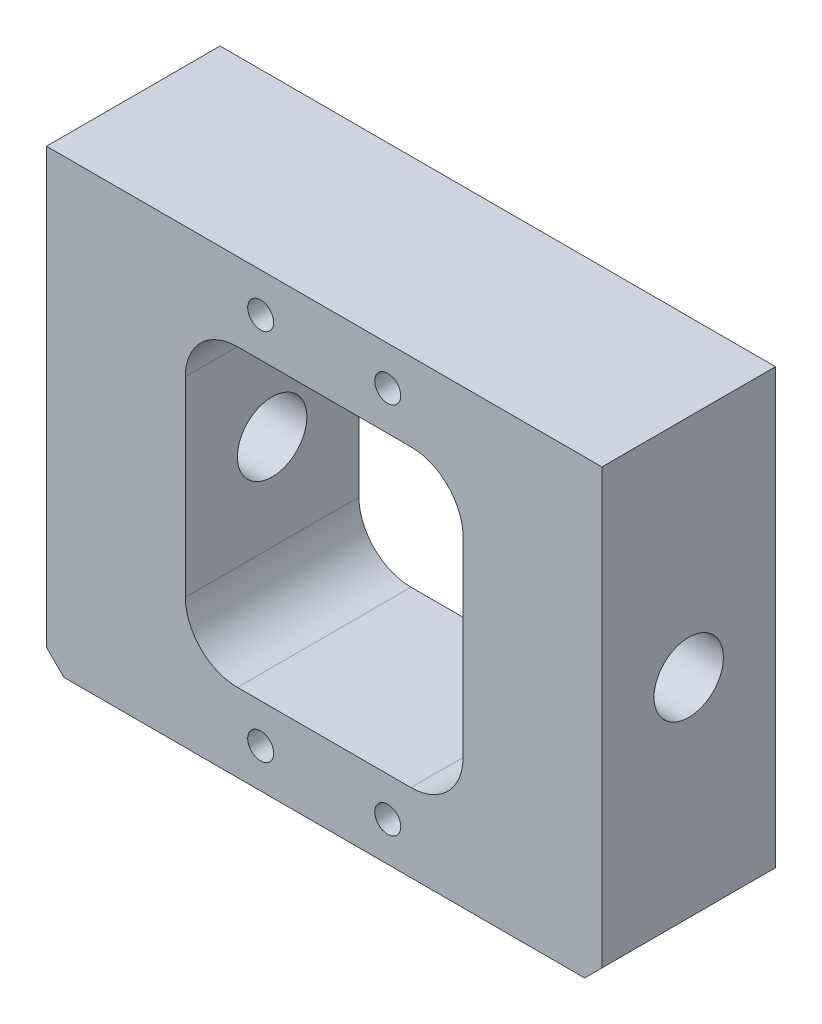
ISO-10303-21;
HEADER;
FILE_DESCRIPTION(('STEP AP214'),'2;1');
FILE_NAME('part.step','',(''),(''),'','','');
FILE_SCHEMA(('AUTOMOTIVE_DESIGN { 1 0 10303 214 1 1 1 1 }'));
ENDSEC;
DATA;
#1=APPLICATION_CONTEXT('core data for automotive mechanical design processes');
#2=APPLICATION_PROTOCOL_DEFINITION('international standard','automotive_design',2000,#1);
#3=PRODUCT_CONTEXT('',#1,'mechanical');
#4=PRODUCT('Part','Part','',(#3));
#5=PRODUCT_RELATED_PRODUCT_CATEGORY('part','',(#4));
#6=PRODUCT_DEFINITION_FORMATION('','',#4);
#7=PRODUCT_DEFINITION_CONTEXT('part definition',#1,'design');
#8=PRODUCT_DEFINITION('design','',#6,#7);
#9=PRODUCT_DEFINITION_SHAPE('','',#8);
#10=(LENGTH_UNIT() NAMED_UNIT(*) SI_UNIT(.MILLI.,.METRE.));
#11=(NAMED_UNIT(*) PLANE_ANGLE_UNIT() SI_UNIT($,.RADIAN.));
#12=(NAMED_UNIT(*) SI_UNIT($,.STERADIAN.) SOLID_ANGLE_UNIT());
#13=UNCERTAINTY_MEASURE_WITH_UNIT(LENGTH_MEASURE(1.E-05),#10,'distance_accuracy_value','');
#14=(GEOMETRIC_REPRESENTATION_CONTEXT(3) GLOBAL_UNCERTAINTY_ASSIGNED_CONTEXT((#13)) GLOBAL_UNIT_ASSIGNED_CONTEXT((#10,
#11,#12)) REPRESENTATION_CONTEXT('',''));
#15=CARTESIAN_POINT('',(0.,0.,0.));
#16=DIRECTION('',(0.,0.,1.));
#17=DIRECTION('',(1.,0.,0.));
#18=AXIS2_PLACEMENT_3D('',#15,#16,#17);
#19=CARTESIAN_POINT('',(16.,13.,10.));
#20=DIRECTION('',(-1.,0.,0.));
#21=DIRECTION('',(0.,-1.,0.));
#22=AXIS2_PLACEMENT_3D('',#19,#20,#21);
#23=PLANE('',#22);
#24=CARTESIAN_POINT('',(16.,0.,5.));
#25=DIRECTION('',(-1.,0.,0.));
#26=DIRECTION('',(0.,0.,1.));
#27=AXIS2_PLACEMENT_3D('',#24,#25,#26);
#28=CIRCLE('',#27,2.);
#29=CARTESIAN_POINT('',(16.,0.,7.));
#30=VERTEX_POINT('',#29);
#31=EDGE_CURVE('E202',#30,#30,#28,.T.);
#32=ORIENTED_EDGE('',*,*,#31,.T.);
#33=EDGE_LOOP('',(#32));
#34=FACE_BOUND('',#33,.T.);
#35=DIRECTION('',(0.,1.,0.));
#36=VECTOR('',#35,1.);
#37=CARTESIAN_POINT('',(16.,13.,10.));
#38=LINE('',#37,#36);
#39=CARTESIAN_POINT('',(16.,-12.,10.));
#40=VERTEX_POINT('',#39);
#41=CARTESIAN_POINT('',(16.,13.,10.));
#42=VERTEX_POINT('',#41);
#43=EDGE_CURVE('E133',#40,#42,#38,.T.);
#44=ORIENTED_EDGE('',*,*,#43,.F.);
#45=DIRECTION('',(0.,0.,-1.));
#46=VECTOR('',#45,1.);
#47=CARTESIAN_POINT('',(16.,-12.,10.));
#48=LINE('',#47,#46);
#49=CARTESIAN_POINT('',(16.,-12.,0.));
#50=VERTEX_POINT('',#49);
#51=EDGE_CURVE('E197',#40,#50,#48,.T.);
#52=ORIENTED_EDGE('',*,*,#51,.T.);
#53=DIRECTION('',(0.,1.,0.));
#54=VECTOR('',#53,1.);
#55=CARTESIAN_POINT('',(16.,13.,0.));
#56=LINE('',#55,#54);
#57=CARTESIAN_POINT('',(16.,13.,0.));
#58=VERTEX_POINT('',#57);
#59=EDGE_CURVE('E154',#50,#58,#56,.T.);
#60=ORIENTED_EDGE('',*,*,#59,.T.);
#61=DIRECTION('',(0.,0.,-1.));
#62=VECTOR('',#61,1.);
#63=CARTESIAN_POINT('',(16.,13.,10.));
#64=LINE('',#63,#62);
#65=EDGE_CURVE('E148',#42,#58,#64,.T.);
#66=ORIENTED_EDGE('',*,*,#65,.F.);
#67=EDGE_LOOP('',(#44,#52,#60,#66));
#68=FACE_BOUND('',#67,.T.);
#69=ADVANCED_FACE('F31',(#34,#68),#23,.F.);
#70=CARTESIAN_POINT('',(-16.,13.,10.));
#71=DIRECTION('',(0.,-1.,0.));
#72=DIRECTION('',(0.,0.,-1.));
#73=AXIS2_PLACEMENT_3D('',#70,#71,#72);
#74=PLANE('',#73);
#75=DIRECTION('',(-1.,0.,0.));
#76=VECTOR('',#75,1.);
#77=CARTESIAN_POINT('',(-16.,13.,0.));
#78=LINE('',#77,#76);
#79=CARTESIAN_POINT('',(-16.,13.,0.));
#80=VERTEX_POINT('',#79);
#81=EDGE_CURVE('E224',#58,#80,#78,.T.);
#82=ORIENTED_EDGE('',*,*,#81,.T.);
#83=DIRECTION('',(0.,0.,-1.));
#84=VECTOR('',#83,1.);
#85=CARTESIAN_POINT('',(-16.,13.,10.));
#86=LINE('',#85,#84);
#87=CARTESIAN_POINT('',(-16.,13.,10.));
#88=VERTEX_POINT('',#87);
#89=EDGE_CURVE('E150',#88,#80,#86,.T.);
#90=ORIENTED_EDGE('',*,*,#89,.F.);
#91=DIRECTION('',(-1.,0.,0.));
#92=VECTOR('',#91,1.);
#93=CARTESIAN_POINT('',(-16.,13.,10.));
#94=LINE('',#93,#92);
#95=EDGE_CURVE('E136',#42,#88,#94,.T.);
#96=ORIENTED_EDGE('',*,*,#95,.F.);
#97=ORIENTED_EDGE('',*,*,#65,.T.);
#98=EDGE_LOOP('',(#82,#90,#96,#97));
#99=FACE_BOUND('',#98,.T.);
#100=ADVANCED_FACE('F147',(#99),#74,.F.);
#101=CARTESIAN_POINT('',(-16.,13.,10.));
#102=DIRECTION('',(1.,0.,0.));
#103=DIRECTION('',(0.,1.,0.));
#104=AXIS2_PLACEMENT_3D('',#101,#102,#103);
#105=PLANE('',#104);
#106=CARTESIAN_POINT('',(-16.,0.,5.));
#107=DIRECTION('',(-1.,0.,0.));
#108=DIRECTION('',(0.,0.,1.));
#109=AXIS2_PLACEMENT_3D('',#106,#107,#108);
#110=CIRCLE('',#109,2.);
#111=CARTESIAN_POINT('',(-16.,0.,7.));
#112=VERTEX_POINT('',#111);
#113=EDGE_CURVE('E256',#112,#112,#110,.T.);
#114=ORIENTED_EDGE('',*,*,#113,.F.);
#115=EDGE_LOOP('',(#114));
#116=FACE_BOUND('',#115,.T.);
#117=DIRECTION('',(0.,-1.,0.));
#118=VECTOR('',#117,1.);
#119=CARTESIAN_POINT('',(-16.,13.,0.));
#120=LINE('',#119,#118);
#121=CARTESIAN_POINT('',(-16.,-12.,0.));
#122=VERTEX_POINT('',#121);
#123=EDGE_CURVE('E222',#80,#122,#120,.T.);
#124=ORIENTED_EDGE('',*,*,#123,.T.);
#125=DIRECTION('',(0.,0.,1.));
#126=VECTOR('',#125,1.);
#127=CARTESIAN_POINT('',(-16.,-12.,10.));
#128=LINE('',#127,#126);
#129=CARTESIAN_POINT('',(-16.,-12.,10.));
#130=VERTEX_POINT('',#129);
#131=EDGE_CURVE('E11',#122,#130,#128,.T.);
#132=ORIENTED_EDGE('',*,*,#131,.T.);
#133=DIRECTION('',(0.,-1.,0.));
#134=VECTOR('',#133,1.);
#135=CARTESIAN_POINT('',(-16.,13.,10.));
#136=LINE('',#135,#134);
#137=EDGE_CURVE('E151',#88,#130,#136,.T.);
#138=ORIENTED_EDGE('',*,*,#137,.F.);
#139=ORIENTED_EDGE('',*,*,#89,.T.);
#140=EDGE_LOOP('',(#124,#132,#138,#139));
#141=FACE_BOUND('',#140,.T.);
#142=ADVANCED_FACE('F223',(#116,#141),#105,.F.);
#143=CARTESIAN_POINT('',(-16.,-13.,10.));
#144=DIRECTION('',(0.,1.,0.));
#145=DIRECTION('',(0.,0.,1.));
#146=AXIS2_PLACEMENT_3D('',#143,#144,#145);
#147=PLANE('',#146);
#148=DIRECTION('',(1.,0.,0.));
#149=VECTOR('',#148,1.);
#150=CARTESIAN_POINT('',(-16.,-13.,0.));
#151=LINE('',#150,#149);
#152=CARTESIAN_POINT('',(-15.,-13.,0.));
#153=VERTEX_POINT('',#152);
#154=CARTESIAN_POINT('',(15.,-13.,0.));
#155=VERTEX_POINT('',#154);
#156=EDGE_CURVE('E143',#153,#155,#151,.T.);
#157=ORIENTED_EDGE('',*,*,#156,.T.);
#158=DIRECTION('',(0.,0.,1.));
#159=VECTOR('',#158,1.);
#160=CARTESIAN_POINT('',(15.,-13.,10.));
#161=LINE('',#160,#159);
#162=CARTESIAN_POINT('',(15.,-13.,10.));
#163=VERTEX_POINT('',#162);
#164=EDGE_CURVE('E52',#155,#163,#161,.T.);
#165=ORIENTED_EDGE('',*,*,#164,.T.);
#166=DIRECTION('',(1.,0.,0.));
#167=VECTOR('',#166,1.);
#168=CARTESIAN_POINT('',(-16.,-13.,10.));
#169=LINE('',#168,#167);
#170=CARTESIAN_POINT('',(-15.,-13.,10.));
#171=VERTEX_POINT('',#170);
#172=EDGE_CURVE('E160',#171,#163,#169,.T.);
#173=ORIENTED_EDGE('',*,*,#172,.F.);
#174=DIRECTION('',(0.,0.,-1.));
#175=VECTOR('',#174,1.);
#176=CARTESIAN_POINT('',(-15.,-13.,10.));
#177=LINE('',#176,#175);
#178=EDGE_CURVE('E208',#171,#153,#177,.T.);
#179=ORIENTED_EDGE('',*,*,#178,.T.);
#180=EDGE_LOOP('',(#157,#165,#173,#179));
#181=FACE_BOUND('',#180,.T.);
#182=ADVANCED_FACE('F216',(#181),#147,.F.);
#183=CARTESIAN_POINT('',(16.,-13.,10.));
#184=DIRECTION('',(0.,0.,1.));
#185=DIRECTION('',(1.,0.,0.));
#186=AXIS2_PLACEMENT_3D('',#183,#184,#185);
#187=PLANE('',#186);
#188=CARTESIAN_POINT('',(3.65999999999999,-10.75,10.));
#189=DIRECTION('',(0.,0.,-1.));
#190=DIRECTION('',(1.,0.,0.));
#191=AXIS2_PLACEMENT_3D('',#188,#189,#190);
#192=CIRCLE('',#191,0.75);
#193=CARTESIAN_POINT('',(4.40999999999999,-10.75,10.));
#194=VERTEX_POINT('',#193);
#195=EDGE_CURVE('E277',#194,#194,#192,.T.);
#196=ORIENTED_EDGE('',*,*,#195,.T.);
#197=EDGE_LOOP('',(#196));
#198=FACE_BOUND('',#197,.T.);
#199=CARTESIAN_POINT('',(-3.66000000000001,-10.75,10.));
#200=DIRECTION('',(0.,0.,-1.));
#201=DIRECTION('',(-1.,0.,0.));
#202=AXIS2_PLACEMENT_3D('',#199,#200,#201);
#203=CIRCLE('',#202,0.75);
#204=CARTESIAN_POINT('',(-4.41000000000001,-10.75,10.));
#205=VERTEX_POINT('',#204);
#206=EDGE_CURVE('E271',#205,#205,#203,.T.);
#207=ORIENTED_EDGE('',*,*,#206,.T.);
#208=EDGE_LOOP('',(#207));
#209=FACE_BOUND('',#208,.T.);
#210=CARTESIAN_POINT('',(-3.66,10.75,10.));
#211=DIRECTION('',(0.,0.,-1.));
#212=DIRECTION('',(1.,0.,0.));
#213=AXIS2_PLACEMENT_3D('',#210,#211,#212);
#214=CIRCLE('',#213,0.75);
#215=CARTESIAN_POINT('',(-2.91,10.75,10.));
#216=VERTEX_POINT('',#215);
#217=EDGE_CURVE('E265',#216,#216,#214,.T.);
#218=ORIENTED_EDGE('',*,*,#217,.T.);
#219=EDGE_LOOP('',(#218));
#220=FACE_BOUND('',#219,.T.);
#221=CARTESIAN_POINT('',(3.66,10.75,10.));
#222=DIRECTION('',(0.,0.,-1.));
#223=DIRECTION('',(-1.,0.,0.));
#224=AXIS2_PLACEMENT_3D('',#221,#222,#223);
#225=CIRCLE('',#224,0.75);
#226=CARTESIAN_POINT('',(2.91,10.75,10.));
#227=VERTEX_POINT('',#226);
#228=EDGE_CURVE('E259',#227,#227,#225,.T.);
#229=ORIENTED_EDGE('',*,*,#228,.T.);
#230=EDGE_LOOP('',(#229));
#231=FACE_BOUND('',#230,.T.);
#232=DIRECTION('',(0.,1.,0.));
#233=VECTOR('',#232,1.);
#234=CARTESIAN_POINT('',(8.,8.5,10.));
#235=LINE('',#234,#233);
#236=CARTESIAN_POINT('',(8.,-5.5,10.));
#237=VERTEX_POINT('',#236);
#238=CARTESIAN_POINT('',(8.,5.5,10.));
#239=VERTEX_POINT('',#238);
#240=EDGE_CURVE('E241',#237,#239,#235,.T.);
#241=ORIENTED_EDGE('',*,*,#240,.F.);
#242=CARTESIAN_POINT('',(5.,-5.5,10.));
#243=DIRECTION('',(0.,0.,1.));
#244=DIRECTION('',(1.,0.,0.));
#245=AXIS2_PLACEMENT_3D('',#242,#243,#244);
#246=CIRCLE('',#245,3.);
#247=CARTESIAN_POINT('',(5.,-8.5,10.));
#248=VERTEX_POINT('',#247);
#249=EDGE_CURVE('E181',#237,#248,#246,.F.);
#250=ORIENTED_EDGE('',*,*,#249,.T.);
#251=DIRECTION('',(1.,0.,0.));
#252=VECTOR('',#251,1.);
#253=CARTESIAN_POINT('',(-8.,-8.5,10.));
#254=LINE('',#253,#252);
#255=CARTESIAN_POINT('',(-5.,-8.5,10.));
#256=VERTEX_POINT('',#255);
#257=EDGE_CURVE('E231',#256,#248,#254,.T.);
#258=ORIENTED_EDGE('',*,*,#257,.F.);
#259=CARTESIAN_POINT('',(-5.,-5.5,10.));
#260=DIRECTION('',(0.,0.,1.));
#261=DIRECTION('',(1.,0.,0.));
#262=AXIS2_PLACEMENT_3D('',#259,#260,#261);
#263=CIRCLE('',#262,3.);
#264=CARTESIAN_POINT('',(-8.,-5.5,10.));
#265=VERTEX_POINT('',#264);
#266=EDGE_CURVE('E193',#256,#265,#263,.F.);
#267=ORIENTED_EDGE('',*,*,#266,.T.);
#268=DIRECTION('',(0.,-1.,0.));
#269=VECTOR('',#268,1.);
#270=CARTESIAN_POINT('',(-8.,8.5,10.));
#271=LINE('',#270,#269);
#272=CARTESIAN_POINT('',(-8.,5.5,10.));
#273=VERTEX_POINT('',#272);
#274=EDGE_CURVE('E235',#273,#265,#271,.T.);
#275=ORIENTED_EDGE('',*,*,#274,.F.);
#276=CARTESIAN_POINT('',(-5.,5.5,10.));
#277=DIRECTION('',(0.,0.,1.));
#278=DIRECTION('',(1.,0.,0.));
#279=AXIS2_PLACEMENT_3D('',#276,#277,#278);
#280=CIRCLE('',#279,3.);
#281=CARTESIAN_POINT('',(-5.,8.5,10.));
#282=VERTEX_POINT('',#281);
#283=EDGE_CURVE('E189',#273,#282,#280,.F.);
#284=ORIENTED_EDGE('',*,*,#283,.T.);
#285=DIRECTION('',(-1.,0.,0.));
#286=VECTOR('',#285,1.);
#287=CARTESIAN_POINT('',(-8.,8.5,10.));
#288=LINE('',#287,#286);
#289=CARTESIAN_POINT('',(5.,8.5,10.));
#290=VERTEX_POINT('',#289);
#291=EDGE_CURVE('E238',#290,#282,#288,.T.);
#292=ORIENTED_EDGE('',*,*,#291,.F.);
#293=CARTESIAN_POINT('',(5.,5.5,10.));
#294=DIRECTION('',(0.,0.,1.));
#295=DIRECTION('',(1.,0.,0.));
#296=AXIS2_PLACEMENT_3D('',#293,#294,#295);
#297=CIRCLE('',#296,3.);
#298=EDGE_CURVE('E185',#290,#239,#297,.F.);
#299=ORIENTED_EDGE('',*,*,#298,.T.);
#300=EDGE_LOOP('',(#241,#250,#258,#267,#275,#284,#292,#299));
#301=FACE_BOUND('',#300,.T.);
#302=ORIENTED_EDGE('',*,*,#172,.T.);
#303=DIRECTION('',(-0.707106781186549,-0.707106781186546,0.));
#304=VECTOR('',#303,1.);
#305=CARTESIAN_POINT('',(15.5,-12.5,10.));
#306=LINE('',#305,#304);
#307=EDGE_CURVE('E39',#163,#40,#306,.F.);
#308=ORIENTED_EDGE('',*,*,#307,.T.);
#309=ORIENTED_EDGE('',*,*,#43,.T.);
#310=ORIENTED_EDGE('',*,*,#95,.T.);
#311=ORIENTED_EDGE('',*,*,#137,.T.);
#312=DIRECTION('',(-0.707106781186546,0.707106781186549,0.));
#313=VECTOR('',#312,1.);
#314=CARTESIAN_POINT('',(0.499999999999952,-28.5,10.));
#315=LINE('',#314,#313);
#316=EDGE_CURVE('E212',#130,#171,#315,.F.);
#317=ORIENTED_EDGE('',*,*,#316,.T.);
#318=EDGE_LOOP('',(#302,#308,#309,#310,#311,#317));
#319=FACE_BOUND('',#318,.T.);
#320=ADVANCED_FACE('F135',(#198,#209,#220,#231,#301,#319),#187,.T.);
#321=CARTESIAN_POINT('',(16.,-13.,0.));
#322=DIRECTION('',(0.,0.,1.));
#323=DIRECTION('',(1.,0.,0.));
#324=AXIS2_PLACEMENT_3D('',#321,#322,#323);
#325=PLANE('',#324);
#326=CARTESIAN_POINT('',(3.65999999999999,-10.75,0.));
#327=DIRECTION('',(0.,0.,-1.));
#328=DIRECTION('',(1.,0.,0.));
#329=AXIS2_PLACEMENT_3D('',#326,#327,#328);
#330=CIRCLE('',#329,0.75);
#331=CARTESIAN_POINT('',(4.40999999999999,-10.75,0.));
#332=VERTEX_POINT('',#331);
#333=EDGE_CURVE('E280',#332,#332,#330,.T.);
#334=ORIENTED_EDGE('',*,*,#333,.F.);
#335=EDGE_LOOP('',(#334));
#336=FACE_BOUND('',#335,.T.);
#337=CARTESIAN_POINT('',(-3.66000000000001,-10.75,0.));
#338=DIRECTION('',(0.,0.,-1.));
#339=DIRECTION('',(-1.,0.,0.));
#340=AXIS2_PLACEMENT_3D('',#337,#338,#339);
#341=CIRCLE('',#340,0.75);
#342=CARTESIAN_POINT('',(-4.41000000000001,-10.75,0.));
#343=VERTEX_POINT('',#342);
#344=EDGE_CURVE('E274',#343,#343,#341,.T.);
#345=ORIENTED_EDGE('',*,*,#344,.F.);
#346=EDGE_LOOP('',(#345));
#347=FACE_BOUND('',#346,.T.);
#348=CARTESIAN_POINT('',(-3.66,10.75,0.));
#349=DIRECTION('',(0.,0.,-1.));
#350=DIRECTION('',(1.,0.,0.));
#351=AXIS2_PLACEMENT_3D('',#348,#349,#350);
#352=CIRCLE('',#351,0.75);
#353=CARTESIAN_POINT('',(-2.91,10.75,0.));
#354=VERTEX_POINT('',#353);
#355=EDGE_CURVE('E268',#354,#354,#352,.T.);
#356=ORIENTED_EDGE('',*,*,#355,.F.);
#357=EDGE_LOOP('',(#356));
#358=FACE_BOUND('',#357,.T.);
#359=CARTESIAN_POINT('',(3.66,10.75,0.));
#360=DIRECTION('',(0.,0.,-1.));
#361=DIRECTION('',(-1.,0.,0.));
#362=AXIS2_PLACEMENT_3D('',#359,#360,#361);
#363=CIRCLE('',#362,0.75);
#364=CARTESIAN_POINT('',(2.91,10.75,0.));
#365=VERTEX_POINT('',#364);
#366=EDGE_CURVE('E262',#365,#365,#363,.T.);
#367=ORIENTED_EDGE('',*,*,#366,.F.);
#368=EDGE_LOOP('',(#367));
#369=FACE_BOUND('',#368,.T.);
#370=DIRECTION('',(0.,-1.,0.));
#371=VECTOR('',#370,1.);
#372=CARTESIAN_POINT('',(-8.,8.5,0.));
#373=LINE('',#372,#371);
#374=CARTESIAN_POINT('',(-8.,5.5,0.));
#375=VERTEX_POINT('',#374);
#376=CARTESIAN_POINT('',(-8.,-5.5,0.));
#377=VERTEX_POINT('',#376);
#378=EDGE_CURVE('E246',#375,#377,#373,.T.);
#379=ORIENTED_EDGE('',*,*,#378,.T.);
#380=CARTESIAN_POINT('',(-5.,-5.5,0.));
#381=DIRECTION('',(0.,0.,1.));
#382=DIRECTION('',(1.,0.,0.));
#383=AXIS2_PLACEMENT_3D('',#380,#381,#382);
#384=CIRCLE('',#383,3.);
#385=CARTESIAN_POINT('',(-5.,-8.5,0.));
#386=VERTEX_POINT('',#385);
#387=EDGE_CURVE('E195',#377,#386,#384,.T.);
#388=ORIENTED_EDGE('',*,*,#387,.T.);
#389=DIRECTION('',(1.,0.,0.));
#390=VECTOR('',#389,1.);
#391=CARTESIAN_POINT('',(-8.,-8.5,0.));
#392=LINE('',#391,#390);
#393=CARTESIAN_POINT('',(5.,-8.5,0.));
#394=VERTEX_POINT('',#393);
#395=EDGE_CURVE('E228',#386,#394,#392,.T.);
#396=ORIENTED_EDGE('',*,*,#395,.T.);
#397=CARTESIAN_POINT('',(5.,-5.5,0.));
#398=DIRECTION('',(0.,0.,1.));
#399=DIRECTION('',(1.,0.,0.));
#400=AXIS2_PLACEMENT_3D('',#397,#398,#399);
#401=CIRCLE('',#400,3.);
#402=CARTESIAN_POINT('',(8.,-5.5,0.));
#403=VERTEX_POINT('',#402);
#404=EDGE_CURVE('E183',#394,#403,#401,.T.);
#405=ORIENTED_EDGE('',*,*,#404,.T.);
#406=DIRECTION('',(0.,1.,0.));
#407=VECTOR('',#406,1.);
#408=CARTESIAN_POINT('',(8.,8.5,0.));
#409=LINE('',#408,#407);
#410=CARTESIAN_POINT('',(8.,5.5,0.));
#411=VERTEX_POINT('',#410);
#412=EDGE_CURVE('E234',#403,#411,#409,.T.);
#413=ORIENTED_EDGE('',*,*,#412,.T.);
#414=CARTESIAN_POINT('',(5.,5.5,0.));
#415=DIRECTION('',(0.,0.,1.));
#416=DIRECTION('',(1.,0.,0.));
#417=AXIS2_PLACEMENT_3D('',#414,#415,#416);
#418=CIRCLE('',#417,3.);
#419=CARTESIAN_POINT('',(5.,8.5,0.));
#420=VERTEX_POINT('',#419);
#421=EDGE_CURVE('E187',#411,#420,#418,.T.);
#422=ORIENTED_EDGE('',*,*,#421,.T.);
#423=DIRECTION('',(-1.,0.,0.));
#424=VECTOR('',#423,1.);
#425=CARTESIAN_POINT('',(-8.,8.5,0.));
#426=LINE('',#425,#424);
#427=CARTESIAN_POINT('',(-5.,8.5,0.));
#428=VERTEX_POINT('',#427);
#429=EDGE_CURVE('E249',#420,#428,#426,.T.);
#430=ORIENTED_EDGE('',*,*,#429,.T.);
#431=CARTESIAN_POINT('',(-5.,5.5,0.));
#432=DIRECTION('',(0.,0.,1.));
#433=DIRECTION('',(1.,0.,0.));
#434=AXIS2_PLACEMENT_3D('',#431,#432,#433);
#435=CIRCLE('',#434,3.);
#436=EDGE_CURVE('E191',#428,#375,#435,.T.);
#437=ORIENTED_EDGE('',*,*,#436,.T.);
#438=EDGE_LOOP('',(#379,#388,#396,#405,#413,#422,#430,#437));
#439=FACE_BOUND('',#438,.T.);
#440=ORIENTED_EDGE('',*,*,#59,.F.);
#441=DIRECTION('',(0.707106781186549,0.707106781186546,0.));
#442=VECTOR('',#441,1.);
#443=CARTESIAN_POINT('',(16.,-12.,0.));
#444=LINE('',#443,#442);
#445=EDGE_CURVE('E206',#50,#155,#444,.F.);
#446=ORIENTED_EDGE('',*,*,#445,.T.);
#447=ORIENTED_EDGE('',*,*,#156,.F.);
#448=DIRECTION('',(0.707106781186546,-0.707106781186549,0.));
#449=VECTOR('',#448,1.);
#450=CARTESIAN_POINT('',(-15.,-13.,0.));
#451=LINE('',#450,#449);
#452=EDGE_CURVE('E204',#153,#122,#451,.F.);
#453=ORIENTED_EDGE('',*,*,#452,.T.);
#454=ORIENTED_EDGE('',*,*,#123,.F.);
#455=ORIENTED_EDGE('',*,*,#81,.F.);
#456=EDGE_LOOP('',(#440,#446,#447,#453,#454,#455));
#457=FACE_BOUND('',#456,.T.);
#458=ADVANCED_FACE('F221',(#336,#347,#358,#369,#439,#457),#325,.F.);
#459=CARTESIAN_POINT('',(8.,8.5,0.));
#460=DIRECTION('',(1.,0.,0.));
#461=DIRECTION('',(0.,1.,0.));
#462=AXIS2_PLACEMENT_3D('',#459,#460,#461);
#463=PLANE('',#462);
#464=CARTESIAN_POINT('',(8.,0.,5.));
#465=DIRECTION('',(1.,0.,0.));
#466=DIRECTION('',(0.,1.,0.));
#467=AXIS2_PLACEMENT_3D('',#464,#465,#466);
#468=CIRCLE('',#467,2.);
#469=CARTESIAN_POINT('',(8.,2.,5.));
#470=VERTEX_POINT('',#469);
#471=EDGE_CURVE('E201',#470,#470,#468,.T.);
#472=ORIENTED_EDGE('',*,*,#471,.T.);
#473=EDGE_LOOP('',(#472));
#474=FACE_BOUND('',#473,.T.);
#475=ORIENTED_EDGE('',*,*,#412,.F.);
#476=DIRECTION('',(0.,0.,1.));
#477=VECTOR('',#476,1.);
#478=CARTESIAN_POINT('',(8.,-5.5,10.));
#479=LINE('',#478,#477);
#480=EDGE_CURVE('E158',#403,#237,#479,.T.);
#481=ORIENTED_EDGE('',*,*,#480,.T.);
#482=ORIENTED_EDGE('',*,*,#240,.T.);
#483=DIRECTION('',(0.,0.,1.));
#484=VECTOR('',#483,1.);
#485=CARTESIAN_POINT('',(8.,5.5,0.));
#486=LINE('',#485,#484);
#487=EDGE_CURVE('E156',#239,#411,#486,.F.);
#488=ORIENTED_EDGE('',*,*,#487,.T.);
#489=EDGE_LOOP('',(#475,#481,#482,#488));
#490=FACE_BOUND('',#489,.T.);
#491=ADVANCED_FACE('F297',(#474,#490),#463,.F.);
#492=CARTESIAN_POINT('',(-8.,-8.5,0.));
#493=DIRECTION('',(0.,-1.,0.));
#494=DIRECTION('',(0.,0.,-1.));
#495=AXIS2_PLACEMENT_3D('',#492,#493,#494);
#496=PLANE('',#495);
#497=ORIENTED_EDGE('',*,*,#257,.T.);
#498=DIRECTION('',(0.,0.,1.));
#499=VECTOR('',#498,1.);
#500=CARTESIAN_POINT('',(5.,-8.5,0.));
#501=LINE('',#500,#499);
#502=EDGE_CURVE('E169',#248,#394,#501,.F.);
#503=ORIENTED_EDGE('',*,*,#502,.T.);
#504=ORIENTED_EDGE('',*,*,#395,.F.);
#505=DIRECTION('',(0.,0.,1.));
#506=VECTOR('',#505,1.);
#507=CARTESIAN_POINT('',(-5.,-8.5,10.));
#508=LINE('',#507,#506);
#509=EDGE_CURVE('E166',#386,#256,#508,.T.);
#510=ORIENTED_EDGE('',*,*,#509,.T.);
#511=EDGE_LOOP('',(#497,#503,#504,#510));
#512=FACE_BOUND('',#511,.T.);
#513=ADVANCED_FACE('F317',(#512),#496,.F.);
#514=CARTESIAN_POINT('',(-8.,8.5,0.));
#515=DIRECTION('',(-1.,0.,0.));
#516=DIRECTION('',(0.,-1.,0.));
#517=AXIS2_PLACEMENT_3D('',#514,#515,#516);
#518=PLANE('',#517);
#519=CARTESIAN_POINT('',(-8.,0.,5.));
#520=DIRECTION('',(-1.,0.,0.));
#521=DIRECTION('',(0.,-1.,0.));
#522=AXIS2_PLACEMENT_3D('',#519,#520,#521);
#523=CIRCLE('',#522,2.);
#524=CARTESIAN_POINT('',(-8.,-2.,5.));
#525=VERTEX_POINT('',#524);
#526=EDGE_CURVE('E198',#525,#525,#523,.T.);
#527=ORIENTED_EDGE('',*,*,#526,.T.);
#528=EDGE_LOOP('',(#527));
#529=FACE_BOUND('',#528,.T.);
#530=ORIENTED_EDGE('',*,*,#378,.F.);
#531=DIRECTION('',(0.,0.,1.));
#532=VECTOR('',#531,1.);
#533=CARTESIAN_POINT('',(-8.,5.5,10.));
#534=LINE('',#533,#532);
#535=EDGE_CURVE('E178',#375,#273,#534,.T.);
#536=ORIENTED_EDGE('',*,*,#535,.T.);
#537=ORIENTED_EDGE('',*,*,#274,.T.);
#538=DIRECTION('',(0.,0.,1.));
#539=VECTOR('',#538,1.);
#540=CARTESIAN_POINT('',(-8.,-5.5,0.));
#541=LINE('',#540,#539);
#542=EDGE_CURVE('E176',#265,#377,#541,.F.);
#543=ORIENTED_EDGE('',*,*,#542,.T.);
#544=EDGE_LOOP('',(#530,#536,#537,#543));
#545=FACE_BOUND('',#544,.T.);
#546=ADVANCED_FACE('F340',(#529,#545),#518,.F.);
#547=CARTESIAN_POINT('',(-8.,8.5,0.));
#548=DIRECTION('',(0.,1.,0.));
#549=DIRECTION('',(0.,0.,1.));
#550=AXIS2_PLACEMENT_3D('',#547,#548,#549);
#551=PLANE('',#550);
#552=ORIENTED_EDGE('',*,*,#429,.F.);
#553=DIRECTION('',(0.,0.,1.));
#554=VECTOR('',#553,1.);
#555=CARTESIAN_POINT('',(5.,8.5,10.));
#556=LINE('',#555,#554);
#557=EDGE_CURVE('E173',#420,#290,#556,.T.);
#558=ORIENTED_EDGE('',*,*,#557,.T.);
#559=ORIENTED_EDGE('',*,*,#291,.T.);
#560=DIRECTION('',(0.,0.,1.));
#561=VECTOR('',#560,1.);
#562=CARTESIAN_POINT('',(-5.,8.5,0.));
#563=LINE('',#562,#561);
#564=EDGE_CURVE('E171',#282,#428,#563,.F.);
#565=ORIENTED_EDGE('',*,*,#564,.T.);
#566=EDGE_LOOP('',(#552,#558,#559,#565));
#567=FACE_BOUND('',#566,.T.);
#568=ADVANCED_FACE('F336',(#567),#551,.F.);
#569=CARTESIAN_POINT('',(5.,-5.5,0.));
#570=DIRECTION('',(0.,0.,-1.));
#571=DIRECTION('',(-1.,0.,0.));
#572=AXIS2_PLACEMENT_3D('',#569,#570,#571);
#573=CYLINDRICAL_SURFACE('',#572,3.);
#574=ORIENTED_EDGE('',*,*,#404,.F.);
#575=ORIENTED_EDGE('',*,*,#502,.F.);
#576=ORIENTED_EDGE('',*,*,#249,.F.);
#577=ORIENTED_EDGE('',*,*,#480,.F.);
#578=EDGE_LOOP('',(#574,#575,#576,#577));
#579=FACE_BOUND('',#578,.T.);
#580=ADVANCED_FACE('F325',(#579),#573,.F.);
#581=CARTESIAN_POINT('',(5.,5.5,0.));
#582=DIRECTION('',(0.,0.,-1.));
#583=DIRECTION('',(-1.,0.,0.));
#584=AXIS2_PLACEMENT_3D('',#581,#582,#583);
#585=CYLINDRICAL_SURFACE('',#584,3.);
#586=ORIENTED_EDGE('',*,*,#421,.F.);
#587=ORIENTED_EDGE('',*,*,#487,.F.);
#588=ORIENTED_EDGE('',*,*,#298,.F.);
#589=ORIENTED_EDGE('',*,*,#557,.F.);
#590=EDGE_LOOP('',(#586,#587,#588,#589));
#591=FACE_BOUND('',#590,.T.);
#592=ADVANCED_FACE('F333',(#591),#585,.F.);
#593=CARTESIAN_POINT('',(-5.,5.5,0.));
#594=DIRECTION('',(0.,0.,-1.));
#595=DIRECTION('',(-1.,0.,0.));
#596=AXIS2_PLACEMENT_3D('',#593,#594,#595);
#597=CYLINDRICAL_SURFACE('',#596,3.);
#598=ORIENTED_EDGE('',*,*,#436,.F.);
#599=ORIENTED_EDGE('',*,*,#564,.F.);
#600=ORIENTED_EDGE('',*,*,#283,.F.);
#601=ORIENTED_EDGE('',*,*,#535,.F.);
#602=EDGE_LOOP('',(#598,#599,#600,#601));
#603=FACE_BOUND('',#602,.T.);
#604=ADVANCED_FACE('F339',(#603),#597,.F.);
#605=CARTESIAN_POINT('',(-5.,-5.5,0.));
#606=DIRECTION('',(0.,0.,-1.));
#607=DIRECTION('',(-1.,0.,0.));
#608=AXIS2_PLACEMENT_3D('',#605,#606,#607);
#609=CYLINDRICAL_SURFACE('',#608,3.);
#610=ORIENTED_EDGE('',*,*,#387,.F.);
#611=ORIENTED_EDGE('',*,*,#542,.F.);
#612=ORIENTED_EDGE('',*,*,#266,.F.);
#613=ORIENTED_EDGE('',*,*,#509,.F.);
#614=EDGE_LOOP('',(#610,#611,#612,#613));
#615=FACE_BOUND('',#614,.T.);
#616=ADVANCED_FACE('F314',(#615),#609,.F.);
#617=CARTESIAN_POINT('',(16.,0.,5.));
#618=DIRECTION('',(-1.,0.,0.));
#619=DIRECTION('',(0.,0.,1.));
#620=AXIS2_PLACEMENT_3D('',#617,#618,#619);
#621=CYLINDRICAL_SURFACE('',#620,2.);
#622=ORIENTED_EDGE('',*,*,#113,.T.);
#623=EDGE_LOOP('',(#622));
#624=FACE_BOUND('',#623,.T.);
#625=ORIENTED_EDGE('',*,*,#526,.F.);
#626=EDGE_LOOP('',(#625));
#627=FACE_BOUND('',#626,.T.);
#628=ADVANCED_FACE('F366',(#624,#627),#621,.F.);
#629=ORIENTED_EDGE('',*,*,#31,.F.);
#630=EDGE_LOOP('',(#629));
#631=FACE_BOUND('',#630,.T.);
#632=ORIENTED_EDGE('',*,*,#471,.F.);
#633=EDGE_LOOP('',(#632));
#634=FACE_BOUND('',#633,.T.);
#635=ADVANCED_FACE('F369',(#631,#634),#621,.F.);
#636=CARTESIAN_POINT('',(16.,-12.,10.));
#637=DIRECTION('',(-0.707106781186546,0.707106781186549,0.));
#638=DIRECTION('',(-0.707106781186549,-0.707106781186546,0.));
#639=AXIS2_PLACEMENT_3D('',#636,#637,#638);
#640=PLANE('',#639);
#641=ORIENTED_EDGE('',*,*,#307,.F.);
#642=ORIENTED_EDGE('',*,*,#164,.F.);
#643=ORIENTED_EDGE('',*,*,#445,.F.);
#644=ORIENTED_EDGE('',*,*,#51,.F.);
#645=EDGE_LOOP('',(#641,#642,#643,#644));
#646=FACE_BOUND('',#645,.T.);
#647=ADVANCED_FACE('F367',(#646),#640,.F.);
#648=CARTESIAN_POINT('',(-15.,-13.,10.));
#649=DIRECTION('',(0.707106781186549,0.707106781186546,0.));
#650=DIRECTION('',(-0.707106781186546,0.707106781186549,0.));
#651=AXIS2_PLACEMENT_3D('',#648,#649,#650);
#652=PLANE('',#651);
#653=ORIENTED_EDGE('',*,*,#316,.F.);
#654=ORIENTED_EDGE('',*,*,#131,.F.);
#655=ORIENTED_EDGE('',*,*,#452,.F.);
#656=ORIENTED_EDGE('',*,*,#178,.F.);
#657=EDGE_LOOP('',(#653,#654,#655,#656));
#658=FACE_BOUND('',#657,.T.);
#659=ADVANCED_FACE('F33',(#658),#652,.F.);
#660=CARTESIAN_POINT('',(3.66,10.75,10.));
#661=DIRECTION('',(0.,0.,-1.));
#662=DIRECTION('',(-1.,0.,0.));
#663=AXIS2_PLACEMENT_3D('',#660,#661,#662);
#664=CYLINDRICAL_SURFACE('',#663,0.75);
#665=ORIENTED_EDGE('',*,*,#228,.F.);
#666=EDGE_LOOP('',(#665));
#667=FACE_BOUND('',#666,.T.);
#668=ORIENTED_EDGE('',*,*,#366,.T.);
#669=EDGE_LOOP('',(#668));
#670=FACE_BOUND('',#669,.T.);
#671=ADVANCED_FACE('F375',(#667,#670),#664,.F.);
#672=CARTESIAN_POINT('',(-3.66,10.75,10.));
#673=DIRECTION('',(0.,0.,-1.));
#674=DIRECTION('',(-1.,0.,0.));
#675=AXIS2_PLACEMENT_3D('',#672,#673,#674);
#676=CYLINDRICAL_SURFACE('',#675,0.75);
#677=ORIENTED_EDGE('',*,*,#217,.F.);
#678=EDGE_LOOP('',(#677));
#679=FACE_BOUND('',#678,.T.);
#680=ORIENTED_EDGE('',*,*,#355,.T.);
#681=EDGE_LOOP('',(#680));
#682=FACE_BOUND('',#681,.T.);
#683=ADVANCED_FACE('F387',(#679,#682),#676,.F.);
#684=CARTESIAN_POINT('',(-3.66000000000001,-10.75,10.));
#685=DIRECTION('',(0.,0.,-1.));
#686=DIRECTION('',(-1.,0.,0.));
#687=AXIS2_PLACEMENT_3D('',#684,#685,#686);
#688=CYLINDRICAL_SURFACE('',#687,0.75);
#689=ORIENTED_EDGE('',*,*,#206,.F.);
#690=EDGE_LOOP('',(#689));
#691=FACE_BOUND('',#690,.T.);
#692=ORIENTED_EDGE('',*,*,#344,.T.);
#693=EDGE_LOOP('',(#692));
#694=FACE_BOUND('',#693,.T.);
#695=ADVANCED_FACE('F291',(#691,#694),#688,.F.);
#696=CARTESIAN_POINT('',(3.65999999999999,-10.75,10.));
#697=DIRECTION('',(0.,0.,-1.));
#698=DIRECTION('',(-1.,0.,0.));
#699=AXIS2_PLACEMENT_3D('',#696,#697,#698);
#700=CYLINDRICAL_SURFACE('',#699,0.75);
#701=ORIENTED_EDGE('',*,*,#195,.F.);
#702=EDGE_LOOP('',(#701));
#703=FACE_BOUND('',#702,.T.);
#704=ORIENTED_EDGE('',*,*,#333,.T.);
#705=EDGE_LOOP('',(#704));
#706=FACE_BOUND('',#705,.T.);
#707=ADVANCED_FACE('F288',(#703,#706),#700,.F.);
#708=CLOSED_SHELL('',(#69,#100,#142,#182,#320,#458,#491,#513,#546,#568,#580,#592,#604,#616,#628,
#635,#647,#659,#671,#683,#695,#707));
#709=MANIFOLD_SOLID_BREP('B2',#708);
#710=ADVANCED_BREP_SHAPE_REPRESENTATION('',(#18,#709),#14);
#711=SHAPE_DEFINITION_REPRESENTATION(#9,#710);
ENDSEC;
END-ISO-10303-21;
